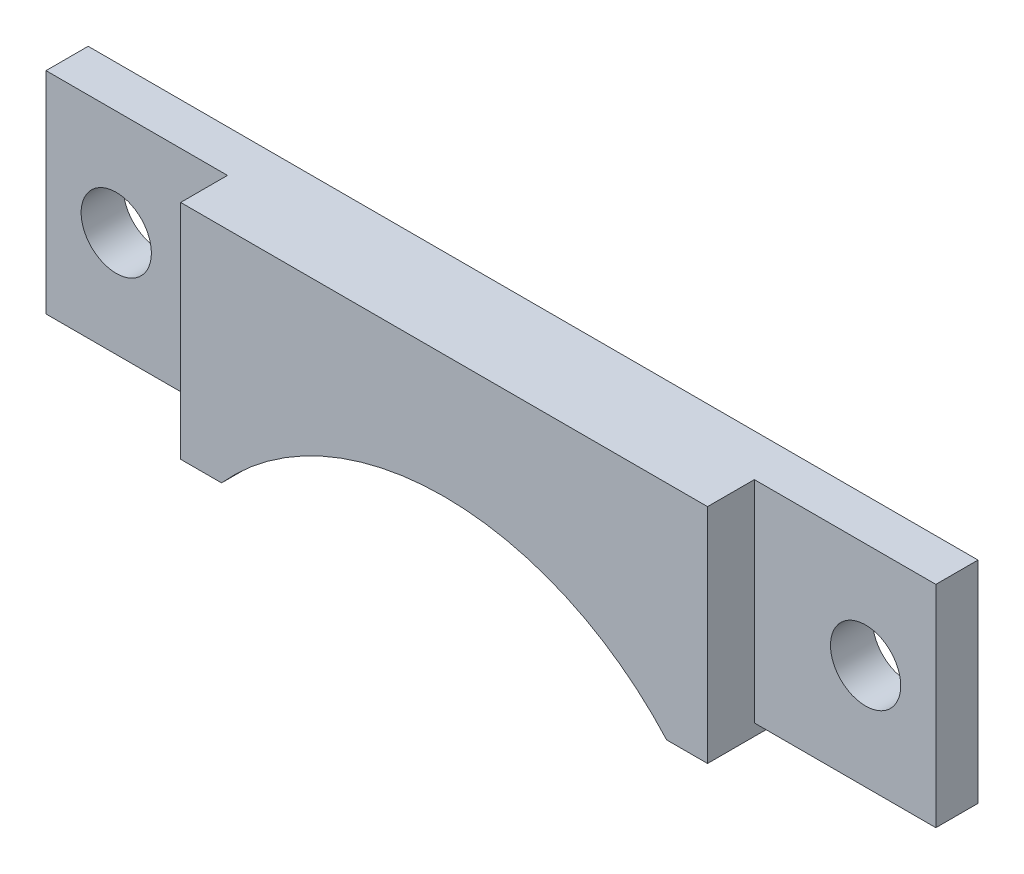
ISO-10303-21;
HEADER;
FILE_DESCRIPTION(('STEP AP214'),'2;1');
FILE_NAME('part.step','',(''),(''),'','','');
FILE_SCHEMA(('AUTOMOTIVE_DESIGN { 1 0 10303 214 1 1 1 1 }'));
ENDSEC;
DATA;
#1=APPLICATION_CONTEXT('core data for automotive mechanical design processes');
#2=APPLICATION_PROTOCOL_DEFINITION('international standard','automotive_design',2000,#1);
#3=PRODUCT_CONTEXT('',#1,'mechanical');
#4=PRODUCT('Part','Part','',(#3));
#5=PRODUCT_RELATED_PRODUCT_CATEGORY('part','',(#4));
#6=PRODUCT_DEFINITION_FORMATION('','',#4);
#7=PRODUCT_DEFINITION_CONTEXT('part definition',#1,'design');
#8=PRODUCT_DEFINITION('design','',#6,#7);
#9=PRODUCT_DEFINITION_SHAPE('','',#8);
#10=(LENGTH_UNIT() NAMED_UNIT(*) SI_UNIT(.MILLI.,.METRE.));
#11=(NAMED_UNIT(*) PLANE_ANGLE_UNIT() SI_UNIT($,.RADIAN.));
#12=(NAMED_UNIT(*) SI_UNIT($,.STERADIAN.) SOLID_ANGLE_UNIT());
#13=UNCERTAINTY_MEASURE_WITH_UNIT(LENGTH_MEASURE(1.E-05),#10,'distance_accuracy_value','');
#14=(GEOMETRIC_REPRESENTATION_CONTEXT(3) GLOBAL_UNCERTAINTY_ASSIGNED_CONTEXT((#13)) GLOBAL_UNIT_ASSIGNED_CONTEXT((#10,
#11,#12)) REPRESENTATION_CONTEXT('',''));
#15=CARTESIAN_POINT('',(0.,0.,0.));
#16=DIRECTION('',(0.,0.,1.));
#17=DIRECTION('',(1.,0.,0.));
#18=AXIS2_PLACEMENT_3D('',#15,#16,#17);
#19=CARTESIAN_POINT('',(0.,-13.25,1.8));
#20=DIRECTION('',(0.,0.,1.));
#21=DIRECTION('',(1.,0.,0.));
#22=AXIS2_PLACEMENT_3D('',#19,#20,#21);
#23=PLANE('',#22);
#24=DIRECTION('',(-1.,0.,0.));
#25=VECTOR('',#24,1.);
#26=CARTESIAN_POINT('',(11.25,-4.25,1.8));
#27=LINE('',#26,#25);
#28=CARTESIAN_POINT('',(19.,-4.25,1.8));
#29=VERTEX_POINT('',#28);
#30=CARTESIAN_POINT('',(11.25,-4.25,1.8));
#31=VERTEX_POINT('',#30);
#32=EDGE_CURVE('E51',#29,#31,#27,.T.);
#33=ORIENTED_EDGE('',*,*,#32,.F.);
#34=DIRECTION('',(0.,1.,0.));
#35=VECTOR('',#34,1.);
#36=CARTESIAN_POINT('',(19.,4.75,1.8));
#37=LINE('',#36,#35);
#38=CARTESIAN_POINT('',(19.,4.75,1.8));
#39=VERTEX_POINT('',#38);
#40=EDGE_CURVE('E141',#29,#39,#37,.T.);
#41=ORIENTED_EDGE('',*,*,#40,.T.);
#42=DIRECTION('',(-1.,0.,0.));
#43=VECTOR('',#42,1.);
#44=CARTESIAN_POINT('',(19.,4.75,1.8));
#45=LINE('',#44,#43);
#46=CARTESIAN_POINT('',(11.25,4.75,1.8));
#47=VERTEX_POINT('',#46);
#48=EDGE_CURVE('E161',#39,#47,#45,.T.);
#49=ORIENTED_EDGE('',*,*,#48,.T.);
#50=DIRECTION('',(0.,-1.,0.));
#51=VECTOR('',#50,1.);
#52=CARTESIAN_POINT('',(11.25,0.,1.8));
#53=LINE('',#52,#51);
#54=EDGE_CURVE('E191',#47,#31,#53,.T.);
#55=ORIENTED_EDGE('',*,*,#54,.T.);
#56=EDGE_LOOP('',(#33,#41,#49,#55));
#57=FACE_BOUND('',#56,.T.);
#58=CARTESIAN_POINT('',(16.,0.250000000000001,1.8));
#59=DIRECTION('',(0.,0.,1.));
#60=DIRECTION('',(1.,0.,0.));
#61=AXIS2_PLACEMENT_3D('',#58,#59,#60);
#62=CIRCLE('',#61,1.5);
#63=CARTESIAN_POINT('',(17.5,0.250000000000001,1.8));
#64=VERTEX_POINT('',#63);
#65=EDGE_CURVE('E225',#64,#64,#62,.T.);
#66=ORIENTED_EDGE('',*,*,#65,.F.);
#67=EDGE_LOOP('',(#66));
#68=FACE_BOUND('',#67,.T.);
#69=ADVANCED_FACE('F36',(#57,#68),#23,.T.);
#70=DIRECTION('',(-1.,0.,0.));
#71=VECTOR('',#70,1.);
#72=CARTESIAN_POINT('',(-11.25,-4.25,1.8));
#73=LINE('',#72,#71);
#74=CARTESIAN_POINT('',(-11.25,-4.25,1.8));
#75=VERTEX_POINT('',#74);
#76=CARTESIAN_POINT('',(-19.,-4.25,1.8));
#77=VERTEX_POINT('',#76);
#78=EDGE_CURVE('E178',#75,#77,#73,.T.);
#79=ORIENTED_EDGE('',*,*,#78,.F.);
#80=DIRECTION('',(0.,1.,0.));
#81=VECTOR('',#80,1.);
#82=CARTESIAN_POINT('',(-11.25,0.,1.8));
#83=LINE('',#82,#81);
#84=CARTESIAN_POINT('',(-11.25,4.75,1.8));
#85=VERTEX_POINT('',#84);
#86=EDGE_CURVE('E59',#75,#85,#83,.T.);
#87=ORIENTED_EDGE('',*,*,#86,.T.);
#88=CARTESIAN_POINT('',(-19.,4.75,1.8));
#89=VERTEX_POINT('',#88);
#90=EDGE_CURVE('E234',#85,#89,#45,.T.);
#91=ORIENTED_EDGE('',*,*,#90,.T.);
#92=DIRECTION('',(0.,-1.,0.));
#93=VECTOR('',#92,1.);
#94=CARTESIAN_POINT('',(-19.,4.75,1.8));
#95=LINE('',#94,#93);
#96=EDGE_CURVE('E150',#89,#77,#95,.T.);
#97=ORIENTED_EDGE('',*,*,#96,.T.);
#98=EDGE_LOOP('',(#79,#87,#91,#97));
#99=FACE_BOUND('',#98,.T.);
#100=CARTESIAN_POINT('',(-16.,0.250000000000001,1.8));
#101=DIRECTION('',(0.,0.,1.));
#102=DIRECTION('',(1.,0.,0.));
#103=AXIS2_PLACEMENT_3D('',#100,#101,#102);
#104=CIRCLE('',#103,1.5);
#105=CARTESIAN_POINT('',(-14.5,0.250000000000001,1.8));
#106=VERTEX_POINT('',#105);
#107=EDGE_CURVE('E219',#106,#106,#104,.T.);
#108=ORIENTED_EDGE('',*,*,#107,.F.);
#109=EDGE_LOOP('',(#108));
#110=FACE_BOUND('',#109,.T.);
#111=ADVANCED_FACE('F278',(#99,#110),#23,.T.);
#112=CARTESIAN_POINT('',(0.,-13.25,0.));
#113=DIRECTION('',(0.,0.,1.));
#114=DIRECTION('',(1.,0.,0.));
#115=AXIS2_PLACEMENT_3D('',#112,#113,#114);
#116=PLANE('',#115);
#117=DIRECTION('',(-1.,0.,0.));
#118=VECTOR('',#117,1.);
#119=CARTESIAN_POINT('',(11.25,-4.25,0.));
#120=LINE('',#119,#118);
#121=CARTESIAN_POINT('',(19.,-4.25,0.));
#122=VERTEX_POINT('',#121);
#123=CARTESIAN_POINT('',(11.25,-4.25,0.));
#124=VERTEX_POINT('',#123);
#125=EDGE_CURVE('E124',#122,#124,#120,.T.);
#126=ORIENTED_EDGE('',*,*,#125,.T.);
#127=DIRECTION('',(0.,-1.,0.));
#128=VECTOR('',#127,1.);
#129=CARTESIAN_POINT('',(11.25,-4.75,0.));
#130=LINE('',#129,#128);
#131=CARTESIAN_POINT('',(11.25,-4.75,0.));
#132=VERTEX_POINT('',#131);
#133=EDGE_CURVE('E133',#124,#132,#130,.T.);
#134=ORIENTED_EDGE('',*,*,#133,.T.);
#135=DIRECTION('',(1.,0.,0.));
#136=VECTOR('',#135,1.);
#137=CARTESIAN_POINT('',(19.,-4.75,0.));
#138=LINE('',#137,#136);
#139=CARTESIAN_POINT('',(9.50328890437411,-4.75,0.));
#140=VERTEX_POINT('',#139);
#141=EDGE_CURVE('E148',#140,#132,#138,.T.);
#142=ORIENTED_EDGE('',*,*,#141,.F.);
#143=CARTESIAN_POINT('',(0.,-13.25,0.));
#144=DIRECTION('',(0.,0.,-1.));
#145=DIRECTION('',(1.,0.,0.));
#146=AXIS2_PLACEMENT_3D('',#143,#144,#145);
#147=CIRCLE('',#146,12.75);
#148=CARTESIAN_POINT('',(-9.50328890437411,-4.75,0.));
#149=VERTEX_POINT('',#148);
#150=EDGE_CURVE('E153',#149,#140,#147,.T.);
#151=ORIENTED_EDGE('',*,*,#150,.F.);
#152=DIRECTION('',(1.,0.,0.));
#153=VECTOR('',#152,1.);
#154=CARTESIAN_POINT('',(-9.50328890437411,-4.75,0.));
#155=LINE('',#154,#153);
#156=CARTESIAN_POINT('',(-11.25,-4.75,0.));
#157=VERTEX_POINT('',#156);
#158=EDGE_CURVE('E239',#157,#149,#155,.T.);
#159=ORIENTED_EDGE('',*,*,#158,.F.);
#160=DIRECTION('',(0.,1.,0.));
#161=VECTOR('',#160,1.);
#162=CARTESIAN_POINT('',(-11.25,-4.75,0.));
#163=LINE('',#162,#161);
#164=CARTESIAN_POINT('',(-11.25,-4.25,0.));
#165=VERTEX_POINT('',#164);
#166=EDGE_CURVE('E180',#157,#165,#163,.T.);
#167=ORIENTED_EDGE('',*,*,#166,.T.);
#168=DIRECTION('',(-1.,0.,0.));
#169=VECTOR('',#168,1.);
#170=CARTESIAN_POINT('',(-11.25,-4.25,0.));
#171=LINE('',#170,#169);
#172=CARTESIAN_POINT('',(-19.,-4.25,0.));
#173=VERTEX_POINT('',#172);
#174=EDGE_CURVE('E183',#165,#173,#171,.T.);
#175=ORIENTED_EDGE('',*,*,#174,.T.);
#176=DIRECTION('',(0.,-1.,0.));
#177=VECTOR('',#176,1.);
#178=CARTESIAN_POINT('',(-19.,4.75,0.));
#179=LINE('',#178,#177);
#180=CARTESIAN_POINT('',(-19.,4.75,0.));
#181=VERTEX_POINT('',#180);
#182=EDGE_CURVE('E228',#181,#173,#179,.T.);
#183=ORIENTED_EDGE('',*,*,#182,.F.);
#184=DIRECTION('',(-1.,0.,0.));
#185=VECTOR('',#184,1.);
#186=CARTESIAN_POINT('',(19.,4.75,0.));
#187=LINE('',#186,#185);
#188=CARTESIAN_POINT('',(19.,4.75,0.));
#189=VERTEX_POINT('',#188);
#190=EDGE_CURVE('E147',#189,#181,#187,.T.);
#191=ORIENTED_EDGE('',*,*,#190,.F.);
#192=DIRECTION('',(0.,1.,0.));
#193=VECTOR('',#192,1.);
#194=CARTESIAN_POINT('',(19.,4.75,0.));
#195=LINE('',#194,#193);
#196=EDGE_CURVE('E139',#122,#189,#195,.T.);
#197=ORIENTED_EDGE('',*,*,#196,.F.);
#198=EDGE_LOOP('',(#126,#134,#142,#151,#159,#167,#175,#183,#191,#197));
#199=FACE_BOUND('',#198,.T.);
#200=CARTESIAN_POINT('',(16.,0.250000000000001,0.));
#201=DIRECTION('',(0.,0.,1.));
#202=DIRECTION('',(1.,0.,0.));
#203=AXIS2_PLACEMENT_3D('',#200,#201,#202);
#204=CIRCLE('',#203,1.5);
#205=CARTESIAN_POINT('',(17.5,0.250000000000001,0.));
#206=VERTEX_POINT('',#205);
#207=EDGE_CURVE('E222',#206,#206,#204,.T.);
#208=ORIENTED_EDGE('',*,*,#207,.T.);
#209=EDGE_LOOP('',(#208));
#210=FACE_BOUND('',#209,.T.);
#211=CARTESIAN_POINT('',(-16.,0.250000000000001,0.));
#212=DIRECTION('',(0.,0.,1.));
#213=DIRECTION('',(1.,0.,0.));
#214=AXIS2_PLACEMENT_3D('',#211,#212,#213);
#215=CIRCLE('',#214,1.5);
#216=CARTESIAN_POINT('',(-14.5,0.250000000000001,0.));
#217=VERTEX_POINT('',#216);
#218=EDGE_CURVE('E218',#217,#217,#215,.T.);
#219=ORIENTED_EDGE('',*,*,#218,.T.);
#220=EDGE_LOOP('',(#219));
#221=FACE_BOUND('',#220,.T.);
#222=ADVANCED_FACE('F144',(#199,#210,#221),#116,.F.);
#223=CARTESIAN_POINT('',(-19.,4.75,1.8));
#224=DIRECTION('',(1.,0.,0.));
#225=DIRECTION('',(0.,0.,-1.));
#226=AXIS2_PLACEMENT_3D('',#223,#224,#225);
#227=PLANE('',#226);
#228=ORIENTED_EDGE('',*,*,#182,.T.);
#229=DIRECTION('',(0.,0.,1.));
#230=VECTOR('',#229,1.);
#231=CARTESIAN_POINT('',(-19.,-4.25,0.));
#232=LINE('',#231,#230);
#233=EDGE_CURVE('E188',#173,#77,#232,.T.);
#234=ORIENTED_EDGE('',*,*,#233,.T.);
#235=ORIENTED_EDGE('',*,*,#96,.F.);
#236=DIRECTION('',(0.,0.,-1.));
#237=VECTOR('',#236,1.);
#238=CARTESIAN_POINT('',(-19.,4.75,1.8));
#239=LINE('',#238,#237);
#240=EDGE_CURVE('E157',#89,#181,#239,.T.);
#241=ORIENTED_EDGE('',*,*,#240,.T.);
#242=EDGE_LOOP('',(#228,#234,#235,#241));
#243=FACE_BOUND('',#242,.T.);
#244=ADVANCED_FACE('F38',(#243),#227,.F.);
#245=CARTESIAN_POINT('',(-9.50328890437411,-4.75,1.8));
#246=DIRECTION('',(0.,1.,0.));
#247=DIRECTION('',(-1.,0.,0.));
#248=AXIS2_PLACEMENT_3D('',#245,#246,#247);
#249=PLANE('',#248);
#250=DIRECTION('',(0.,0.,-1.));
#251=VECTOR('',#250,1.);
#252=CARTESIAN_POINT('',(-11.25,-4.75,3.8));
#253=LINE('',#252,#251);
#254=CARTESIAN_POINT('',(-11.25,-4.75,3.8));
#255=VERTEX_POINT('',#254);
#256=EDGE_CURVE('E212',#255,#157,#253,.T.);
#257=ORIENTED_EDGE('',*,*,#256,.T.);
#258=ORIENTED_EDGE('',*,*,#158,.T.);
#259=DIRECTION('',(0.,0.,-1.));
#260=VECTOR('',#259,1.);
#261=CARTESIAN_POINT('',(-9.50328890437411,-4.75,1.8));
#262=LINE('',#261,#260);
#263=CARTESIAN_POINT('',(-9.50328890437411,-4.75,3.8));
#264=VERTEX_POINT('',#263);
#265=EDGE_CURVE('E11',#264,#149,#262,.T.);
#266=ORIENTED_EDGE('',*,*,#265,.F.);
#267=DIRECTION('',(1.,0.,0.));
#268=VECTOR('',#267,1.);
#269=CARTESIAN_POINT('',(0.,-4.74999999999999,3.8));
#270=LINE('',#269,#268);
#271=EDGE_CURVE('E201',#255,#264,#270,.T.);
#272=ORIENTED_EDGE('',*,*,#271,.F.);
#273=EDGE_LOOP('',(#257,#258,#266,#272));
#274=FACE_BOUND('',#273,.T.);
#275=ADVANCED_FACE('F243',(#274),#249,.F.);
#276=CARTESIAN_POINT('',(0.,-13.25,1.8));
#277=DIRECTION('',(0.,0.,-1.));
#278=DIRECTION('',(-1.,0.,0.));
#279=AXIS2_PLACEMENT_3D('',#276,#277,#278);
#280=CYLINDRICAL_SURFACE('',#279,12.75);
#281=ORIENTED_EDGE('',*,*,#150,.T.);
#282=DIRECTION('',(0.,0.,-1.));
#283=VECTOR('',#282,1.);
#284=CARTESIAN_POINT('',(9.50328890437411,-4.75,1.8));
#285=LINE('',#284,#283);
#286=CARTESIAN_POINT('',(9.50328890437411,-4.75,3.8));
#287=VERTEX_POINT('',#286);
#288=EDGE_CURVE('E44',#287,#140,#285,.T.);
#289=ORIENTED_EDGE('',*,*,#288,.F.);
#290=CARTESIAN_POINT('',(0.,-13.25,3.8));
#291=DIRECTION('',(0.,0.,1.));
#292=DIRECTION('',(1.,0.,0.));
#293=AXIS2_PLACEMENT_3D('',#290,#291,#292);
#294=CIRCLE('',#293,12.75);
#295=EDGE_CURVE('E204',#264,#287,#294,.F.);
#296=ORIENTED_EDGE('',*,*,#295,.F.);
#297=ORIENTED_EDGE('',*,*,#265,.T.);
#298=EDGE_LOOP('',(#281,#289,#296,#297));
#299=FACE_BOUND('',#298,.T.);
#300=ADVANCED_FACE('F240',(#299),#280,.F.);
#301=CARTESIAN_POINT('',(19.,-4.75,1.8));
#302=DIRECTION('',(0.,1.,0.));
#303=DIRECTION('',(-1.,0.,0.));
#304=AXIS2_PLACEMENT_3D('',#301,#302,#303);
#305=PLANE('',#304);
#306=ORIENTED_EDGE('',*,*,#141,.T.);
#307=DIRECTION('',(0.,0.,-1.));
#308=VECTOR('',#307,1.);
#309=CARTESIAN_POINT('',(11.25,-4.75,3.8));
#310=LINE('',#309,#308);
#311=CARTESIAN_POINT('',(11.25,-4.75,3.8));
#312=VERTEX_POINT('',#311);
#313=EDGE_CURVE('E207',#312,#132,#310,.T.);
#314=ORIENTED_EDGE('',*,*,#313,.F.);
#315=DIRECTION('',(1.,0.,0.));
#316=VECTOR('',#315,1.);
#317=CARTESIAN_POINT('',(0.,-4.74999999999999,3.8));
#318=LINE('',#317,#316);
#319=EDGE_CURVE('E168',#287,#312,#318,.T.);
#320=ORIENTED_EDGE('',*,*,#319,.F.);
#321=ORIENTED_EDGE('',*,*,#288,.T.);
#322=EDGE_LOOP('',(#306,#314,#320,#321));
#323=FACE_BOUND('',#322,.T.);
#324=ADVANCED_FACE('F166',(#323),#305,.F.);
#325=CARTESIAN_POINT('',(19.,4.75,1.8));
#326=DIRECTION('',(-1.,0.,0.));
#327=DIRECTION('',(0.,0.,1.));
#328=AXIS2_PLACEMENT_3D('',#325,#326,#327);
#329=PLANE('',#328);
#330=ORIENTED_EDGE('',*,*,#40,.F.);
#331=DIRECTION('',(0.,0.,1.));
#332=VECTOR('',#331,1.);
#333=CARTESIAN_POINT('',(19.,-4.25,0.));
#334=LINE('',#333,#332);
#335=EDGE_CURVE('E127',#122,#29,#334,.T.);
#336=ORIENTED_EDGE('',*,*,#335,.F.);
#337=ORIENTED_EDGE('',*,*,#196,.T.);
#338=DIRECTION('',(0.,0.,-1.));
#339=VECTOR('',#338,1.);
#340=CARTESIAN_POINT('',(19.,4.75,1.8));
#341=LINE('',#340,#339);
#342=EDGE_CURVE('E160',#39,#189,#341,.T.);
#343=ORIENTED_EDGE('',*,*,#342,.F.);
#344=EDGE_LOOP('',(#330,#336,#337,#343));
#345=FACE_BOUND('',#344,.T.);
#346=ADVANCED_FACE('F137',(#345),#329,.F.);
#347=CARTESIAN_POINT('',(19.,4.75,1.8));
#348=DIRECTION('',(0.,-1.,0.));
#349=DIRECTION('',(0.,0.,-1.));
#350=AXIS2_PLACEMENT_3D('',#347,#348,#349);
#351=PLANE('',#350);
#352=ORIENTED_EDGE('',*,*,#190,.T.);
#353=ORIENTED_EDGE('',*,*,#240,.F.);
#354=ORIENTED_EDGE('',*,*,#90,.F.);
#355=DIRECTION('',(0.,0.,-1.));
#356=VECTOR('',#355,1.);
#357=CARTESIAN_POINT('',(-11.25,4.75,3.8));
#358=LINE('',#357,#356);
#359=CARTESIAN_POINT('',(-11.25,4.75,3.8));
#360=VERTEX_POINT('',#359);
#361=EDGE_CURVE('E214',#360,#85,#358,.T.);
#362=ORIENTED_EDGE('',*,*,#361,.F.);
#363=DIRECTION('',(-1.,0.,0.));
#364=VECTOR('',#363,1.);
#365=CARTESIAN_POINT('',(0.,4.75,3.8));
#366=LINE('',#365,#364);
#367=CARTESIAN_POINT('',(11.25,4.75,3.8));
#368=VERTEX_POINT('',#367);
#369=EDGE_CURVE('E196',#368,#360,#366,.T.);
#370=ORIENTED_EDGE('',*,*,#369,.F.);
#371=DIRECTION('',(0.,0.,-1.));
#372=VECTOR('',#371,1.);
#373=CARTESIAN_POINT('',(11.25,4.75,3.8));
#374=LINE('',#373,#372);
#375=EDGE_CURVE('E216',#368,#47,#374,.T.);
#376=ORIENTED_EDGE('',*,*,#375,.T.);
#377=ORIENTED_EDGE('',*,*,#48,.F.);
#378=ORIENTED_EDGE('',*,*,#342,.T.);
#379=EDGE_LOOP('',(#352,#353,#354,#362,#370,#376,#377,#378));
#380=FACE_BOUND('',#379,.T.);
#381=ADVANCED_FACE('F260',(#380),#351,.F.);
#382=CARTESIAN_POINT('',(16.,0.250000000000001,1.8));
#383=DIRECTION('',(0.,0.,-1.));
#384=DIRECTION('',(-1.,0.,0.));
#385=AXIS2_PLACEMENT_3D('',#382,#383,#384);
#386=CYLINDRICAL_SURFACE('',#385,1.5);
#387=ORIENTED_EDGE('',*,*,#65,.T.);
#388=EDGE_LOOP('',(#387));
#389=FACE_BOUND('',#388,.T.);
#390=ORIENTED_EDGE('',*,*,#207,.F.);
#391=EDGE_LOOP('',(#390));
#392=FACE_BOUND('',#391,.T.);
#393=ADVANCED_FACE('F274',(#389,#392),#386,.F.);
#394=CARTESIAN_POINT('',(-16.,0.250000000000001,1.8));
#395=DIRECTION('',(0.,0.,-1.));
#396=DIRECTION('',(-1.,0.,0.));
#397=AXIS2_PLACEMENT_3D('',#394,#395,#396);
#398=CYLINDRICAL_SURFACE('',#397,1.5);
#399=ORIENTED_EDGE('',*,*,#107,.T.);
#400=EDGE_LOOP('',(#399));
#401=FACE_BOUND('',#400,.T.);
#402=ORIENTED_EDGE('',*,*,#218,.F.);
#403=EDGE_LOOP('',(#402));
#404=FACE_BOUND('',#403,.T.);
#405=ADVANCED_FACE('F267',(#401,#404),#398,.F.);
#406=CARTESIAN_POINT('',(11.25,0.,3.8));
#407=DIRECTION('',(1.,0.,0.));
#408=DIRECTION('',(0.,0.,-1.));
#409=AXIS2_PLACEMENT_3D('',#406,#407,#408);
#410=PLANE('',#409);
#411=ORIENTED_EDGE('',*,*,#54,.F.);
#412=ORIENTED_EDGE('',*,*,#375,.F.);
#413=DIRECTION('',(0.,-1.,0.));
#414=VECTOR('',#413,1.);
#415=CARTESIAN_POINT('',(11.25,0.,3.8));
#416=LINE('',#415,#414);
#417=EDGE_CURVE('E193',#368,#312,#416,.T.);
#418=ORIENTED_EDGE('',*,*,#417,.T.);
#419=ORIENTED_EDGE('',*,*,#313,.T.);
#420=ORIENTED_EDGE('',*,*,#133,.F.);
#421=DIRECTION('',(0.,0.,1.));
#422=VECTOR('',#421,1.);
#423=CARTESIAN_POINT('',(11.25,-4.25,0.));
#424=LINE('',#423,#422);
#425=EDGE_CURVE('E128',#124,#31,#424,.T.);
#426=ORIENTED_EDGE('',*,*,#425,.T.);
#427=EDGE_LOOP('',(#411,#412,#418,#419,#420,#426));
#428=FACE_BOUND('',#427,.T.);
#429=ADVANCED_FACE('F265',(#428),#410,.T.);
#430=CARTESIAN_POINT('',(-11.25,0.,3.8));
#431=DIRECTION('',(-1.,0.,0.));
#432=DIRECTION('',(0.,0.,1.));
#433=AXIS2_PLACEMENT_3D('',#430,#431,#432);
#434=PLANE('',#433);
#435=ORIENTED_EDGE('',*,*,#86,.F.);
#436=DIRECTION('',(0.,0.,1.));
#437=VECTOR('',#436,1.);
#438=CARTESIAN_POINT('',(-11.25,-4.25,0.));
#439=LINE('',#438,#437);
#440=EDGE_CURVE('E186',#165,#75,#439,.T.);
#441=ORIENTED_EDGE('',*,*,#440,.F.);
#442=ORIENTED_EDGE('',*,*,#166,.F.);
#443=ORIENTED_EDGE('',*,*,#256,.F.);
#444=DIRECTION('',(0.,1.,0.));
#445=VECTOR('',#444,1.);
#446=CARTESIAN_POINT('',(-11.25,0.,3.8));
#447=LINE('',#446,#445);
#448=EDGE_CURVE('E198',#255,#360,#447,.T.);
#449=ORIENTED_EDGE('',*,*,#448,.T.);
#450=ORIENTED_EDGE('',*,*,#361,.T.);
#451=EDGE_LOOP('',(#435,#441,#442,#443,#449,#450));
#452=FACE_BOUND('',#451,.T.);
#453=ADVANCED_FACE('F251',(#452),#434,.T.);
#454=CARTESIAN_POINT('',(0.,0.,3.8));
#455=DIRECTION('',(0.,0.,1.));
#456=DIRECTION('',(1.,0.,0.));
#457=AXIS2_PLACEMENT_3D('',#454,#455,#456);
#458=PLANE('',#457);
#459=ORIENTED_EDGE('',*,*,#417,.F.);
#460=ORIENTED_EDGE('',*,*,#369,.T.);
#461=ORIENTED_EDGE('',*,*,#448,.F.);
#462=ORIENTED_EDGE('',*,*,#271,.T.);
#463=ORIENTED_EDGE('',*,*,#295,.T.);
#464=ORIENTED_EDGE('',*,*,#319,.T.);
#465=EDGE_LOOP('',(#459,#460,#461,#462,#463,#464));
#466=FACE_BOUND('',#465,.T.);
#467=ADVANCED_FACE('F247',(#466),#458,.T.);
#468=CARTESIAN_POINT('',(-11.25,-4.25,0.));
#469=DIRECTION('',(0.,1.,0.));
#470=DIRECTION('',(-1.,0.,0.));
#471=AXIS2_PLACEMENT_3D('',#468,#469,#470);
#472=PLANE('',#471);
#473=ORIENTED_EDGE('',*,*,#78,.T.);
#474=ORIENTED_EDGE('',*,*,#233,.F.);
#475=ORIENTED_EDGE('',*,*,#174,.F.);
#476=ORIENTED_EDGE('',*,*,#440,.T.);
#477=EDGE_LOOP('',(#473,#474,#475,#476));
#478=FACE_BOUND('',#477,.T.);
#479=ADVANCED_FACE('F323',(#478),#472,.F.);
#480=CARTESIAN_POINT('',(11.25,-4.25,0.));
#481=DIRECTION('',(0.,1.,0.));
#482=DIRECTION('',(-1.,0.,0.));
#483=AXIS2_PLACEMENT_3D('',#480,#481,#482);
#484=PLANE('',#483);
#485=ORIENTED_EDGE('',*,*,#32,.T.);
#486=ORIENTED_EDGE('',*,*,#425,.F.);
#487=ORIENTED_EDGE('',*,*,#125,.F.);
#488=ORIENTED_EDGE('',*,*,#335,.T.);
#489=EDGE_LOOP('',(#485,#486,#487,#488));
#490=FACE_BOUND('',#489,.T.);
#491=ADVANCED_FACE('F126',(#490),#484,.F.);
#492=CLOSED_SHELL('',(#69,#111,#222,#244,#275,#300,#324,#346,#381,#393,#405,#429,#453,#467,#479,#491));
#493=MANIFOLD_SOLID_BREP('B2',#492);
#494=ADVANCED_BREP_SHAPE_REPRESENTATION('',(#18,#493),#14);
#495=SHAPE_DEFINITION_REPRESENTATION(#9,#494);
ENDSEC;
END-ISO-10303-21;
